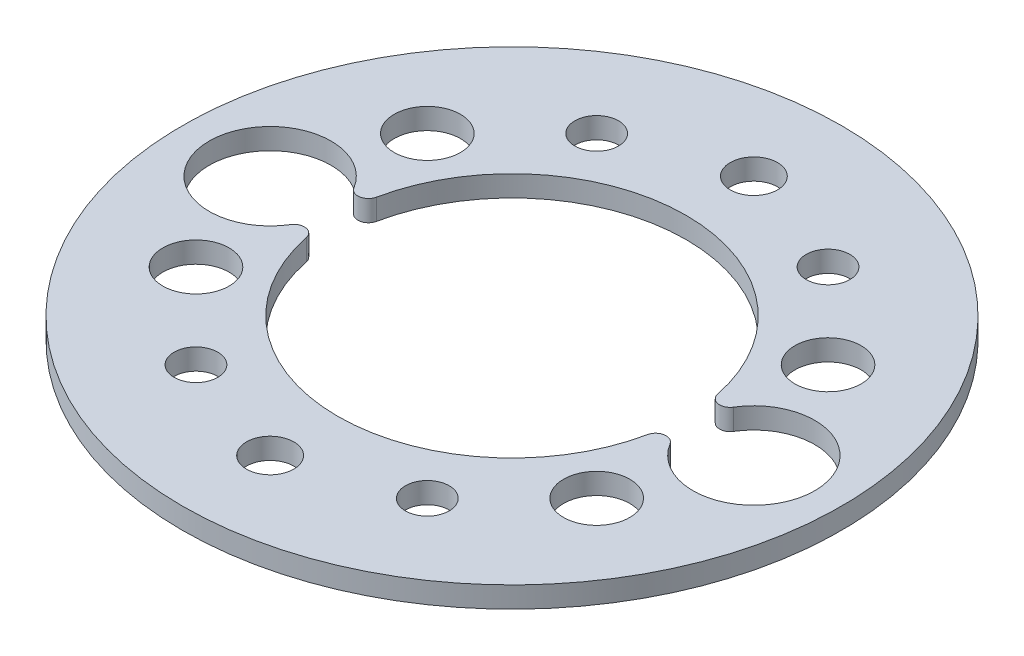
ISO-10303-21;
HEADER;
FILE_DESCRIPTION(('STEP AP214'),'2;1');
FILE_NAME('part.step','',(''),(''),'','','');
FILE_SCHEMA(('AUTOMOTIVE_DESIGN { 1 0 10303 214 1 1 1 1 }'));
ENDSEC;
DATA;
#1=APPLICATION_CONTEXT('core data for automotive mechanical design processes');
#2=APPLICATION_PROTOCOL_DEFINITION('international standard','automotive_design',2000,#1);
#3=PRODUCT_CONTEXT('',#1,'mechanical');
#4=PRODUCT('Part','Part','',(#3));
#5=PRODUCT_RELATED_PRODUCT_CATEGORY('part','',(#4));
#6=PRODUCT_DEFINITION_FORMATION('','',#4);
#7=PRODUCT_DEFINITION_CONTEXT('part definition',#1,'design');
#8=PRODUCT_DEFINITION('design','',#6,#7);
#9=PRODUCT_DEFINITION_SHAPE('','',#8);
#10=(LENGTH_UNIT() NAMED_UNIT(*) SI_UNIT(.MILLI.,.METRE.));
#11=(NAMED_UNIT(*) PLANE_ANGLE_UNIT() SI_UNIT($,.RADIAN.));
#12=(NAMED_UNIT(*) SI_UNIT($,.STERADIAN.) SOLID_ANGLE_UNIT());
#13=UNCERTAINTY_MEASURE_WITH_UNIT(LENGTH_MEASURE(1.E-05),#10,'distance_accuracy_value','');
#14=(GEOMETRIC_REPRESENTATION_CONTEXT(3) GLOBAL_UNCERTAINTY_ASSIGNED_CONTEXT((#13)) GLOBAL_UNIT_ASSIGNED_CONTEXT((#10,
#11,#12)) REPRESENTATION_CONTEXT('',''));
#15=CARTESIAN_POINT('',(0.,0.,0.));
#16=DIRECTION('',(0.,0.,1.));
#17=DIRECTION('',(1.,0.,0.));
#18=AXIS2_PLACEMENT_3D('',#15,#16,#17);
#19=CARTESIAN_POINT('',(0.,3.175,0.));
#20=DIRECTION('',(0.,1.,0.));
#21=DIRECTION('',(0.,0.,1.));
#22=AXIS2_PLACEMENT_3D('',#19,#20,#21);
#23=PLANE('',#22);
#24=CARTESIAN_POINT('',(0.,3.175,0.));
#25=DIRECTION('',(0.,1.,0.));
#26=DIRECTION('',(0.,0.,1.));
#27=AXIS2_PLACEMENT_3D('',#24,#25,#26);
#28=CIRCLE('',#27,26.289);
#29=CARTESIAN_POINT('',(25.7485611877278,3.175,-5.30312339681418));
#30=VERTEX_POINT('',#29);
#31=CARTESIAN_POINT('',(-25.7485611877278,3.175,-5.30312339681418));
#32=VERTEX_POINT('',#31);
#33=EDGE_CURVE('E112',#30,#32,#28,.T.);
#34=ORIENTED_EDGE('',*,*,#33,.F.);
#35=CARTESIAN_POINT('',(27.30342599375,3.175,-5.62336031691166));
#36=DIRECTION('',(0.,-1.,0.));
#37=DIRECTION('',(0.,0.,1.));
#38=AXIS2_PLACEMENT_3D('',#35,#36,#37);
#39=CIRCLE('',#38,1.5875);
#40=CARTESIAN_POINT('',(28.6582993211371,3.175,-4.79603056600513));
#41=VERTEX_POINT('',#40);
#42=EDGE_CURVE('E104',#41,#30,#39,.T.);
#43=ORIENTED_EDGE('',*,*,#42,.F.);
#44=CARTESIAN_POINT('',(36.5125,3.175,0.));
#45=DIRECTION('',(0.,1.,0.));
#46=DIRECTION('',(0.,0.,1.));
#47=AXIS2_PLACEMENT_3D('',#44,#45,#46);
#48=CIRCLE('',#47,9.2027375);
#49=CARTESIAN_POINT('',(28.6582993211371,3.175,4.79603056600514));
#50=VERTEX_POINT('',#49);
#51=EDGE_CURVE('E139',#50,#41,#48,.T.);
#52=ORIENTED_EDGE('',*,*,#51,.F.);
#53=CARTESIAN_POINT('',(27.30342599375,3.175,5.62336031691167));
#54=DIRECTION('',(0.,-1.,0.));
#55=DIRECTION('',(0.,0.,-1.));
#56=AXIS2_PLACEMENT_3D('',#53,#54,#55);
#57=CIRCLE('',#56,1.5875);
#58=CARTESIAN_POINT('',(25.7485611877278,3.175,5.3031233968142));
#59=VERTEX_POINT('',#58);
#60=EDGE_CURVE('E137',#59,#50,#57,.T.);
#61=ORIENTED_EDGE('',*,*,#60,.F.);
#62=CARTESIAN_POINT('',(0.,3.175,0.));
#63=DIRECTION('',(0.,1.,0.));
#64=DIRECTION('',(0.,0.,1.));
#65=AXIS2_PLACEMENT_3D('',#62,#63,#64);
#66=CIRCLE('',#65,26.289);
#67=CARTESIAN_POINT('',(-25.7485611877278,3.175,5.30312339681419));
#68=VERTEX_POINT('',#67);
#69=EDGE_CURVE('E135',#68,#59,#66,.T.);
#70=ORIENTED_EDGE('',*,*,#69,.F.);
#71=CARTESIAN_POINT('',(-27.30342599375,3.175,5.62336031691167));
#72=DIRECTION('',(0.,-1.,0.));
#73=DIRECTION('',(0.,0.,-1.));
#74=AXIS2_PLACEMENT_3D('',#71,#72,#73);
#75=CIRCLE('',#74,1.5875);
#76=CARTESIAN_POINT('',(-28.6582993211371,3.175,4.79603056600514));
#77=VERTEX_POINT('',#76);
#78=EDGE_CURVE('E133',#77,#68,#75,.T.);
#79=ORIENTED_EDGE('',*,*,#78,.F.);
#80=CARTESIAN_POINT('',(-36.5125,3.175,0.));
#81=DIRECTION('',(0.,1.,0.));
#82=DIRECTION('',(0.,0.,1.));
#83=AXIS2_PLACEMENT_3D('',#80,#81,#82);
#84=CIRCLE('',#83,9.2027375);
#85=CARTESIAN_POINT('',(-28.6582993211371,3.175,-4.79603056600513));
#86=VERTEX_POINT('',#85);
#87=EDGE_CURVE('E128',#86,#77,#84,.T.);
#88=ORIENTED_EDGE('',*,*,#87,.F.);
#89=CARTESIAN_POINT('',(-27.30342599375,3.175,-5.62336031691166));
#90=DIRECTION('',(0.,-1.,0.));
#91=DIRECTION('',(0.,0.,1.));
#92=AXIS2_PLACEMENT_3D('',#89,#90,#91);
#93=CIRCLE('',#92,1.5875);
#94=EDGE_CURVE('E126',#32,#86,#93,.T.);
#95=ORIENTED_EDGE('',*,*,#94,.F.);
#96=EDGE_LOOP('',(#34,#43,#52,#61,#70,#79,#88,#95));
#97=FACE_BOUND('',#96,.T.);
#98=CARTESIAN_POINT('',(-30.2459372271715,3.175,17.4625));
#99=DIRECTION('',(0.,1.,0.));
#100=DIRECTION('',(0.,0.,1.));
#101=AXIS2_PLACEMENT_3D('',#98,#99,#100);
#102=CIRCLE('',#101,5.);
#103=CARTESIAN_POINT('',(-30.2459372271715,3.175,22.4625));
#104=VERTEX_POINT('',#103);
#105=EDGE_CURVE('E172',#104,#104,#102,.T.);
#106=ORIENTED_EDGE('',*,*,#105,.F.);
#107=EDGE_LOOP('',(#106));
#108=FACE_BOUND('',#107,.T.);
#109=CARTESIAN_POINT('',(-17.4625,3.175,30.2459372271715));
#110=DIRECTION('',(0.,1.,0.));
#111=DIRECTION('',(0.,0.,1.));
#112=AXIS2_PLACEMENT_3D('',#109,#110,#111);
#113=CIRCLE('',#112,3.3);
#114=CARTESIAN_POINT('',(-17.4625,3.175,33.5459372271715));
#115=VERTEX_POINT('',#114);
#116=EDGE_CURVE('E184',#115,#115,#113,.T.);
#117=ORIENTED_EDGE('',*,*,#116,.F.);
#118=EDGE_LOOP('',(#117));
#119=FACE_BOUND('',#118,.T.);
#120=CARTESIAN_POINT('',(30.2459372271715,3.175,-17.4625));
#121=DIRECTION('',(0.,1.,0.));
#122=DIRECTION('',(0.,0.,1.));
#123=AXIS2_PLACEMENT_3D('',#120,#121,#122);
#124=CIRCLE('',#123,5.);
#125=CARTESIAN_POINT('',(30.2459372271715,3.175,-12.4625));
#126=VERTEX_POINT('',#125);
#127=EDGE_CURVE('E196',#126,#126,#124,.T.);
#128=ORIENTED_EDGE('',*,*,#127,.F.);
#129=EDGE_LOOP('',(#128));
#130=FACE_BOUND('',#129,.T.);
#131=CARTESIAN_POINT('',(17.4625,3.175,-30.2459372271715));
#132=DIRECTION('',(0.,1.,0.));
#133=DIRECTION('',(0.,0.,1.));
#134=AXIS2_PLACEMENT_3D('',#131,#132,#133);
#135=CIRCLE('',#134,3.3);
#136=CARTESIAN_POINT('',(17.4625,3.175,-26.9459372271715));
#137=VERTEX_POINT('',#136);
#138=EDGE_CURVE('E208',#137,#137,#135,.T.);
#139=ORIENTED_EDGE('',*,*,#138,.F.);
#140=EDGE_LOOP('',(#139));
#141=FACE_BOUND('',#140,.T.);
#142=CARTESIAN_POINT('',(0.,3.175,-36.5125));
#143=DIRECTION('',(0.,1.,0.));
#144=DIRECTION('',(0.,0.,1.));
#145=AXIS2_PLACEMENT_3D('',#142,#143,#144);
#146=CIRCLE('',#145,3.571875);
#147=CARTESIAN_POINT('',(0.,3.175,-32.940625));
#148=VERTEX_POINT('',#147);
#149=EDGE_CURVE('E220',#148,#148,#146,.T.);
#150=ORIENTED_EDGE('',*,*,#149,.F.);
#151=EDGE_LOOP('',(#150));
#152=FACE_BOUND('',#151,.T.);
#153=CARTESIAN_POINT('',(0.,3.175,0.));
#154=DIRECTION('',(0.,1.,0.));
#155=DIRECTION('',(0.,0.,1.));
#156=AXIS2_PLACEMENT_3D('',#153,#154,#155);
#157=CIRCLE('',#156,49.75);
#158=CARTESIAN_POINT('',(0.,3.175,49.75));
#159=VERTEX_POINT('',#158);
#160=EDGE_CURVE('E11',#159,#159,#157,.T.);
#161=ORIENTED_EDGE('',*,*,#160,.T.);
#162=EDGE_LOOP('',(#161));
#163=FACE_BOUND('',#162,.T.);
#164=CARTESIAN_POINT('',(0.,3.175,36.5125));
#165=DIRECTION('',(0.,1.,0.));
#166=DIRECTION('',(0.,0.,1.));
#167=AXIS2_PLACEMENT_3D('',#164,#165,#166);
#168=CIRCLE('',#167,3.571875);
#169=CARTESIAN_POINT('',(0.,3.175,40.084375));
#170=VERTEX_POINT('',#169);
#171=EDGE_CURVE('E214',#170,#170,#168,.T.);
#172=ORIENTED_EDGE('',*,*,#171,.F.);
#173=EDGE_LOOP('',(#172));
#174=FACE_BOUND('',#173,.T.);
#175=CARTESIAN_POINT('',(-30.2459372271715,3.175,-17.4625));
#176=DIRECTION('',(0.,1.,0.));
#177=DIRECTION('',(0.,0.,1.));
#178=AXIS2_PLACEMENT_3D('',#175,#176,#177);
#179=CIRCLE('',#178,5.);
#180=CARTESIAN_POINT('',(-30.2459372271715,3.175,-12.4625));
#181=VERTEX_POINT('',#180);
#182=EDGE_CURVE('E202',#181,#181,#179,.T.);
#183=ORIENTED_EDGE('',*,*,#182,.F.);
#184=EDGE_LOOP('',(#183));
#185=FACE_BOUND('',#184,.T.);
#186=CARTESIAN_POINT('',(-17.4624999999998,3.175,-30.2459372271716));
#187=DIRECTION('',(0.,1.,0.));
#188=DIRECTION('',(0.,0.,1.));
#189=AXIS2_PLACEMENT_3D('',#186,#187,#188);
#190=CIRCLE('',#189,3.3);
#191=CARTESIAN_POINT('',(-17.4624999999998,3.175,-26.9459372271716));
#192=VERTEX_POINT('',#191);
#193=EDGE_CURVE('E190',#192,#192,#190,.T.);
#194=ORIENTED_EDGE('',*,*,#193,.F.);
#195=EDGE_LOOP('',(#194));
#196=FACE_BOUND('',#195,.T.);
#197=CARTESIAN_POINT('',(17.4624999999998,3.175,30.2459372271716));
#198=DIRECTION('',(0.,1.,0.));
#199=DIRECTION('',(0.,0.,1.));
#200=AXIS2_PLACEMENT_3D('',#197,#198,#199);
#201=CIRCLE('',#200,3.3);
#202=CARTESIAN_POINT('',(17.4624999999998,3.175,33.5459372271716));
#203=VERTEX_POINT('',#202);
#204=EDGE_CURVE('E178',#203,#203,#201,.T.);
#205=ORIENTED_EDGE('',*,*,#204,.F.);
#206=EDGE_LOOP('',(#205));
#207=FACE_BOUND('',#206,.T.);
#208=CARTESIAN_POINT('',(30.2459372271715,3.175,17.4625));
#209=DIRECTION('',(0.,1.,0.));
#210=DIRECTION('',(0.,0.,1.));
#211=AXIS2_PLACEMENT_3D('',#208,#209,#210);
#212=CIRCLE('',#211,5.);
#213=CARTESIAN_POINT('',(30.2459372271715,3.175,22.4625));
#214=VERTEX_POINT('',#213);
#215=EDGE_CURVE('E142',#214,#214,#212,.T.);
#216=ORIENTED_EDGE('',*,*,#215,.F.);
#217=EDGE_LOOP('',(#216));
#218=FACE_BOUND('',#217,.T.);
#219=ADVANCED_FACE('F39',(#97,#108,#119,#130,#141,#152,#163,#174,#185,#196,#207,#218),#23,.T.);
#220=CARTESIAN_POINT('',(0.,0.,0.));
#221=DIRECTION('',(0.,1.,0.));
#222=DIRECTION('',(0.,0.,1.));
#223=AXIS2_PLACEMENT_3D('',#220,#221,#222);
#224=PLANE('',#223);
#225=CARTESIAN_POINT('',(-30.2459372271715,0.,17.4625));
#226=DIRECTION('',(0.,1.,0.));
#227=DIRECTION('',(0.,0.,1.));
#228=AXIS2_PLACEMENT_3D('',#225,#226,#227);
#229=CIRCLE('',#228,5.);
#230=CARTESIAN_POINT('',(-30.2459372271715,0.,22.4625));
#231=VERTEX_POINT('',#230);
#232=EDGE_CURVE('E120',#231,#231,#229,.T.);
#233=ORIENTED_EDGE('',*,*,#232,.T.);
#234=EDGE_LOOP('',(#233));
#235=FACE_BOUND('',#234,.T.);
#236=CARTESIAN_POINT('',(17.4624999999998,0.,30.2459372271716));
#237=DIRECTION('',(0.,1.,0.));
#238=DIRECTION('',(0.,0.,1.));
#239=AXIS2_PLACEMENT_3D('',#236,#237,#238);
#240=CIRCLE('',#239,3.3);
#241=CARTESIAN_POINT('',(17.4624999999998,0.,33.5459372271716));
#242=VERTEX_POINT('',#241);
#243=EDGE_CURVE('E175',#242,#242,#240,.T.);
#244=ORIENTED_EDGE('',*,*,#243,.T.);
#245=EDGE_LOOP('',(#244));
#246=FACE_BOUND('',#245,.T.);
#247=CARTESIAN_POINT('',(-17.4625,0.,30.2459372271715));
#248=DIRECTION('',(0.,1.,0.));
#249=DIRECTION('',(0.,0.,1.));
#250=AXIS2_PLACEMENT_3D('',#247,#248,#249);
#251=CIRCLE('',#250,3.3);
#252=CARTESIAN_POINT('',(-17.4625,0.,33.5459372271715));
#253=VERTEX_POINT('',#252);
#254=EDGE_CURVE('E181',#253,#253,#251,.T.);
#255=ORIENTED_EDGE('',*,*,#254,.T.);
#256=EDGE_LOOP('',(#255));
#257=FACE_BOUND('',#256,.T.);
#258=CARTESIAN_POINT('',(-17.4624999999998,0.,-30.2459372271716));
#259=DIRECTION('',(0.,1.,0.));
#260=DIRECTION('',(0.,0.,1.));
#261=AXIS2_PLACEMENT_3D('',#258,#259,#260);
#262=CIRCLE('',#261,3.3);
#263=CARTESIAN_POINT('',(-17.4624999999998,0.,-26.9459372271716));
#264=VERTEX_POINT('',#263);
#265=EDGE_CURVE('E187',#264,#264,#262,.T.);
#266=ORIENTED_EDGE('',*,*,#265,.T.);
#267=EDGE_LOOP('',(#266));
#268=FACE_BOUND('',#267,.T.);
#269=CARTESIAN_POINT('',(30.2459372271715,0.,-17.4625));
#270=DIRECTION('',(0.,1.,0.));
#271=DIRECTION('',(0.,0.,1.));
#272=AXIS2_PLACEMENT_3D('',#269,#270,#271);
#273=CIRCLE('',#272,5.);
#274=CARTESIAN_POINT('',(30.2459372271715,0.,-12.4625));
#275=VERTEX_POINT('',#274);
#276=EDGE_CURVE('E193',#275,#275,#273,.T.);
#277=ORIENTED_EDGE('',*,*,#276,.T.);
#278=EDGE_LOOP('',(#277));
#279=FACE_BOUND('',#278,.T.);
#280=CARTESIAN_POINT('',(-30.2459372271715,0.,-17.4625));
#281=DIRECTION('',(0.,1.,0.));
#282=DIRECTION('',(0.,0.,1.));
#283=AXIS2_PLACEMENT_3D('',#280,#281,#282);
#284=CIRCLE('',#283,5.);
#285=CARTESIAN_POINT('',(-30.2459372271715,0.,-12.4625));
#286=VERTEX_POINT('',#285);
#287=EDGE_CURVE('E199',#286,#286,#284,.T.);
#288=ORIENTED_EDGE('',*,*,#287,.T.);
#289=EDGE_LOOP('',(#288));
#290=FACE_BOUND('',#289,.T.);
#291=CARTESIAN_POINT('',(17.4625,0.,-30.2459372271715));
#292=DIRECTION('',(0.,1.,0.));
#293=DIRECTION('',(0.,0.,1.));
#294=AXIS2_PLACEMENT_3D('',#291,#292,#293);
#295=CIRCLE('',#294,3.3);
#296=CARTESIAN_POINT('',(17.4625,0.,-26.9459372271715));
#297=VERTEX_POINT('',#296);
#298=EDGE_CURVE('E205',#297,#297,#295,.T.);
#299=ORIENTED_EDGE('',*,*,#298,.T.);
#300=EDGE_LOOP('',(#299));
#301=FACE_BOUND('',#300,.T.);
#302=CARTESIAN_POINT('',(0.,0.,36.5125));
#303=DIRECTION('',(0.,1.,0.));
#304=DIRECTION('',(0.,0.,1.));
#305=AXIS2_PLACEMENT_3D('',#302,#303,#304);
#306=CIRCLE('',#305,3.571875);
#307=CARTESIAN_POINT('',(0.,0.,40.084375));
#308=VERTEX_POINT('',#307);
#309=EDGE_CURVE('E211',#308,#308,#306,.T.);
#310=ORIENTED_EDGE('',*,*,#309,.T.);
#311=EDGE_LOOP('',(#310));
#312=FACE_BOUND('',#311,.T.);
#313=CARTESIAN_POINT('',(0.,0.,-36.5125));
#314=DIRECTION('',(0.,1.,0.));
#315=DIRECTION('',(0.,0.,1.));
#316=AXIS2_PLACEMENT_3D('',#313,#314,#315);
#317=CIRCLE('',#316,3.571875);
#318=CARTESIAN_POINT('',(0.,0.,-32.940625));
#319=VERTEX_POINT('',#318);
#320=EDGE_CURVE('E217',#319,#319,#317,.T.);
#321=ORIENTED_EDGE('',*,*,#320,.T.);
#322=EDGE_LOOP('',(#321));
#323=FACE_BOUND('',#322,.T.);
#324=CARTESIAN_POINT('',(0.,0.,0.));
#325=DIRECTION('',(0.,1.,0.));
#326=DIRECTION('',(0.,0.,1.));
#327=AXIS2_PLACEMENT_3D('',#324,#325,#326);
#328=CIRCLE('',#327,49.75);
#329=CARTESIAN_POINT('',(0.,0.,49.75));
#330=VERTEX_POINT('',#329);
#331=EDGE_CURVE('E43',#330,#330,#328,.T.);
#332=ORIENTED_EDGE('',*,*,#331,.F.);
#333=EDGE_LOOP('',(#332));
#334=FACE_BOUND('',#333,.T.);
#335=CARTESIAN_POINT('',(27.30342599375,0.,-5.62336031691166));
#336=DIRECTION('',(0.,-1.,0.));
#337=DIRECTION('',(0.,0.,1.));
#338=AXIS2_PLACEMENT_3D('',#335,#336,#337);
#339=CIRCLE('',#338,1.5875);
#340=CARTESIAN_POINT('',(28.6582993211371,0.,-4.79603056600513));
#341=VERTEX_POINT('',#340);
#342=CARTESIAN_POINT('',(25.7485611877278,0.,-5.30312339681418));
#343=VERTEX_POINT('',#342);
#344=EDGE_CURVE('E62',#341,#343,#339,.T.);
#345=ORIENTED_EDGE('',*,*,#344,.T.);
#346=CARTESIAN_POINT('',(0.,0.,0.));
#347=DIRECTION('',(0.,1.,0.));
#348=DIRECTION('',(0.,0.,1.));
#349=AXIS2_PLACEMENT_3D('',#346,#347,#348);
#350=CIRCLE('',#349,26.289);
#351=CARTESIAN_POINT('',(-25.7485611877278,0.,-5.30312339681418));
#352=VERTEX_POINT('',#351);
#353=EDGE_CURVE('E119',#343,#352,#350,.T.);
#354=ORIENTED_EDGE('',*,*,#353,.T.);
#355=CARTESIAN_POINT('',(-27.30342599375,0.,-5.62336031691166));
#356=DIRECTION('',(0.,-1.,0.));
#357=DIRECTION('',(0.,0.,1.));
#358=AXIS2_PLACEMENT_3D('',#355,#356,#357);
#359=CIRCLE('',#358,1.5875);
#360=CARTESIAN_POINT('',(-28.6582993211371,0.,-4.79603056600513));
#361=VERTEX_POINT('',#360);
#362=EDGE_CURVE('E144',#352,#361,#359,.T.);
#363=ORIENTED_EDGE('',*,*,#362,.T.);
#364=CARTESIAN_POINT('',(-36.5125,0.,0.));
#365=DIRECTION('',(0.,1.,0.));
#366=DIRECTION('',(0.,0.,1.));
#367=AXIS2_PLACEMENT_3D('',#364,#365,#366);
#368=CIRCLE('',#367,9.2027375);
#369=CARTESIAN_POINT('',(-28.6582993211371,0.,4.79603056600514));
#370=VERTEX_POINT('',#369);
#371=EDGE_CURVE('E147',#361,#370,#368,.T.);
#372=ORIENTED_EDGE('',*,*,#371,.T.);
#373=CARTESIAN_POINT('',(-27.30342599375,0.,5.62336031691167));
#374=DIRECTION('',(0.,-1.,0.));
#375=DIRECTION('',(0.,0.,-1.));
#376=AXIS2_PLACEMENT_3D('',#373,#374,#375);
#377=CIRCLE('',#376,1.5875);
#378=CARTESIAN_POINT('',(-25.7485611877278,0.,5.30312339681419));
#379=VERTEX_POINT('',#378);
#380=EDGE_CURVE('E150',#370,#379,#377,.T.);
#381=ORIENTED_EDGE('',*,*,#380,.T.);
#382=CARTESIAN_POINT('',(0.,0.,0.));
#383=DIRECTION('',(0.,1.,0.));
#384=DIRECTION('',(0.,0.,1.));
#385=AXIS2_PLACEMENT_3D('',#382,#383,#384);
#386=CIRCLE('',#385,26.289);
#387=CARTESIAN_POINT('',(25.7485611877278,0.,5.3031233968142));
#388=VERTEX_POINT('',#387);
#389=EDGE_CURVE('E153',#379,#388,#386,.T.);
#390=ORIENTED_EDGE('',*,*,#389,.T.);
#391=CARTESIAN_POINT('',(27.30342599375,0.,5.62336031691167));
#392=DIRECTION('',(0.,-1.,0.));
#393=DIRECTION('',(0.,0.,-1.));
#394=AXIS2_PLACEMENT_3D('',#391,#392,#393);
#395=CIRCLE('',#394,1.5875);
#396=CARTESIAN_POINT('',(28.6582993211371,0.,4.79603056600514));
#397=VERTEX_POINT('',#396);
#398=EDGE_CURVE('E156',#388,#397,#395,.T.);
#399=ORIENTED_EDGE('',*,*,#398,.T.);
#400=CARTESIAN_POINT('',(36.5125,0.,0.));
#401=DIRECTION('',(0.,1.,0.));
#402=DIRECTION('',(0.,0.,1.));
#403=AXIS2_PLACEMENT_3D('',#400,#401,#402);
#404=CIRCLE('',#403,9.2027375);
#405=EDGE_CURVE('E113',#397,#341,#404,.T.);
#406=ORIENTED_EDGE('',*,*,#405,.T.);
#407=EDGE_LOOP('',(#345,#354,#363,#372,#381,#390,#399,#406));
#408=FACE_BOUND('',#407,.T.);
#409=CARTESIAN_POINT('',(30.2459372271715,0.,17.4625));
#410=DIRECTION('',(0.,1.,0.));
#411=DIRECTION('',(0.,0.,1.));
#412=AXIS2_PLACEMENT_3D('',#409,#410,#411);
#413=CIRCLE('',#412,5.);
#414=CARTESIAN_POINT('',(30.2459372271715,0.,22.4625));
#415=VERTEX_POINT('',#414);
#416=EDGE_CURVE('E334',#415,#415,#413,.T.);
#417=ORIENTED_EDGE('',*,*,#416,.T.);
#418=EDGE_LOOP('',(#417));
#419=FACE_BOUND('',#418,.T.);
#420=ADVANCED_FACE('F226',(#235,#246,#257,#268,#279,#290,#301,#312,#323,#334,#408,#419),#224,.F.);
#421=CARTESIAN_POINT('',(0.,3.175,0.));
#422=DIRECTION('',(0.,-1.,0.));
#423=DIRECTION('',(0.,0.,-1.));
#424=AXIS2_PLACEMENT_3D('',#421,#422,#423);
#425=CYLINDRICAL_SURFACE('',#424,49.75);
#426=ORIENTED_EDGE('',*,*,#160,.F.);
#427=EDGE_LOOP('',(#426));
#428=FACE_BOUND('',#427,.T.);
#429=ORIENTED_EDGE('',*,*,#331,.T.);
#430=EDGE_LOOP('',(#429));
#431=FACE_BOUND('',#430,.T.);
#432=ADVANCED_FACE('F41',(#428,#431),#425,.T.);
#433=CARTESIAN_POINT('',(0.,3.175,-36.5125));
#434=DIRECTION('',(0.,-1.,0.));
#435=DIRECTION('',(0.,0.,-1.));
#436=AXIS2_PLACEMENT_3D('',#433,#434,#435);
#437=CYLINDRICAL_SURFACE('',#436,3.571875);
#438=ORIENTED_EDGE('',*,*,#149,.T.);
#439=EDGE_LOOP('',(#438));
#440=FACE_BOUND('',#439,.T.);
#441=ORIENTED_EDGE('',*,*,#320,.F.);
#442=EDGE_LOOP('',(#441));
#443=FACE_BOUND('',#442,.T.);
#444=ADVANCED_FACE('F229',(#440,#443),#437,.F.);
#445=CARTESIAN_POINT('',(0.,3.175,36.5125));
#446=DIRECTION('',(0.,-1.,0.));
#447=DIRECTION('',(0.,0.,-1.));
#448=AXIS2_PLACEMENT_3D('',#445,#446,#447);
#449=CYLINDRICAL_SURFACE('',#448,3.571875);
#450=ORIENTED_EDGE('',*,*,#171,.T.);
#451=EDGE_LOOP('',(#450));
#452=FACE_BOUND('',#451,.T.);
#453=ORIENTED_EDGE('',*,*,#309,.F.);
#454=EDGE_LOOP('',(#453));
#455=FACE_BOUND('',#454,.T.);
#456=ADVANCED_FACE('F231',(#452,#455),#449,.F.);
#457=CARTESIAN_POINT('',(17.4625,3.175,-30.2459372271715));
#458=DIRECTION('',(0.,-1.,0.));
#459=DIRECTION('',(0.,0.,-1.));
#460=AXIS2_PLACEMENT_3D('',#457,#458,#459);
#461=CYLINDRICAL_SURFACE('',#460,3.3);
#462=ORIENTED_EDGE('',*,*,#138,.T.);
#463=EDGE_LOOP('',(#462));
#464=FACE_BOUND('',#463,.T.);
#465=ORIENTED_EDGE('',*,*,#298,.F.);
#466=EDGE_LOOP('',(#465));
#467=FACE_BOUND('',#466,.T.);
#468=ADVANCED_FACE('F238',(#464,#467),#461,.F.);
#469=CARTESIAN_POINT('',(-30.2459372271715,3.175,-17.4625));
#470=DIRECTION('',(0.,-1.,0.));
#471=DIRECTION('',(0.,0.,-1.));
#472=AXIS2_PLACEMENT_3D('',#469,#470,#471);
#473=CYLINDRICAL_SURFACE('',#472,5.);
#474=ORIENTED_EDGE('',*,*,#182,.T.);
#475=EDGE_LOOP('',(#474));
#476=FACE_BOUND('',#475,.T.);
#477=ORIENTED_EDGE('',*,*,#287,.F.);
#478=EDGE_LOOP('',(#477));
#479=FACE_BOUND('',#478,.T.);
#480=ADVANCED_FACE('F268',(#476,#479),#473,.F.);
#481=CARTESIAN_POINT('',(30.2459372271715,3.175,-17.4625));
#482=DIRECTION('',(0.,-1.,0.));
#483=DIRECTION('',(0.,0.,-1.));
#484=AXIS2_PLACEMENT_3D('',#481,#482,#483);
#485=CYLINDRICAL_SURFACE('',#484,5.);
#486=ORIENTED_EDGE('',*,*,#127,.T.);
#487=EDGE_LOOP('',(#486));
#488=FACE_BOUND('',#487,.T.);
#489=ORIENTED_EDGE('',*,*,#276,.F.);
#490=EDGE_LOOP('',(#489));
#491=FACE_BOUND('',#490,.T.);
#492=ADVANCED_FACE('F274',(#488,#491),#485,.F.);
#493=CARTESIAN_POINT('',(-17.4624999999998,3.175,-30.2459372271716));
#494=DIRECTION('',(0.,-1.,0.));
#495=DIRECTION('',(0.,0.,-1.));
#496=AXIS2_PLACEMENT_3D('',#493,#494,#495);
#497=CYLINDRICAL_SURFACE('',#496,3.3);
#498=ORIENTED_EDGE('',*,*,#193,.T.);
#499=EDGE_LOOP('',(#498));
#500=FACE_BOUND('',#499,.T.);
#501=ORIENTED_EDGE('',*,*,#265,.F.);
#502=EDGE_LOOP('',(#501));
#503=FACE_BOUND('',#502,.T.);
#504=ADVANCED_FACE('F280',(#500,#503),#497,.F.);
#505=CARTESIAN_POINT('',(-17.4625,3.175,30.2459372271715));
#506=DIRECTION('',(0.,-1.,0.));
#507=DIRECTION('',(0.,0.,-1.));
#508=AXIS2_PLACEMENT_3D('',#505,#506,#507);
#509=CYLINDRICAL_SURFACE('',#508,3.3);
#510=ORIENTED_EDGE('',*,*,#116,.T.);
#511=EDGE_LOOP('',(#510));
#512=FACE_BOUND('',#511,.T.);
#513=ORIENTED_EDGE('',*,*,#254,.F.);
#514=EDGE_LOOP('',(#513));
#515=FACE_BOUND('',#514,.T.);
#516=ADVANCED_FACE('F284',(#512,#515),#509,.F.);
#517=CARTESIAN_POINT('',(17.4624999999998,3.175,30.2459372271716));
#518=DIRECTION('',(0.,-1.,0.));
#519=DIRECTION('',(0.,0.,-1.));
#520=AXIS2_PLACEMENT_3D('',#517,#518,#519);
#521=CYLINDRICAL_SURFACE('',#520,3.3);
#522=ORIENTED_EDGE('',*,*,#204,.T.);
#523=EDGE_LOOP('',(#522));
#524=FACE_BOUND('',#523,.T.);
#525=ORIENTED_EDGE('',*,*,#243,.F.);
#526=EDGE_LOOP('',(#525));
#527=FACE_BOUND('',#526,.T.);
#528=ADVANCED_FACE('F288',(#524,#527),#521,.F.);
#529=CARTESIAN_POINT('',(-30.2459372271715,3.175,17.4625));
#530=DIRECTION('',(0.,-1.,0.));
#531=DIRECTION('',(0.,0.,-1.));
#532=AXIS2_PLACEMENT_3D('',#529,#530,#531);
#533=CYLINDRICAL_SURFACE('',#532,5.);
#534=ORIENTED_EDGE('',*,*,#105,.T.);
#535=EDGE_LOOP('',(#534));
#536=FACE_BOUND('',#535,.T.);
#537=ORIENTED_EDGE('',*,*,#232,.F.);
#538=EDGE_LOOP('',(#537));
#539=FACE_BOUND('',#538,.T.);
#540=ADVANCED_FACE('F292',(#536,#539),#533,.F.);
#541=CARTESIAN_POINT('',(27.30342599375,3.175,-5.62336031691166));
#542=DIRECTION('',(0.,-1.,0.));
#543=DIRECTION('',(0.,0.,-1.));
#544=AXIS2_PLACEMENT_3D('',#541,#542,#543);
#545=CYLINDRICAL_SURFACE('',#544,1.5875);
#546=ORIENTED_EDGE('',*,*,#344,.F.);
#547=DIRECTION('',(0.,-1.,0.));
#548=VECTOR('',#547,1.);
#549=CARTESIAN_POINT('',(28.6582993211371,3.175,-4.79603056600513));
#550=LINE('',#549,#548);
#551=EDGE_CURVE('E108',#41,#341,#550,.T.);
#552=ORIENTED_EDGE('',*,*,#551,.F.);
#553=ORIENTED_EDGE('',*,*,#42,.T.);
#554=DIRECTION('',(0.,-1.,0.));
#555=VECTOR('',#554,1.);
#556=CARTESIAN_POINT('',(25.7485611877278,3.175,-5.30312339681418));
#557=LINE('',#556,#555);
#558=EDGE_CURVE('E107',#30,#343,#557,.T.);
#559=ORIENTED_EDGE('',*,*,#558,.T.);
#560=EDGE_LOOP('',(#546,#552,#553,#559));
#561=FACE_BOUND('',#560,.T.);
#562=ADVANCED_FACE('F106',(#561),#545,.T.);
#563=CARTESIAN_POINT('',(0.,3.175,0.));
#564=DIRECTION('',(0.,-1.,0.));
#565=DIRECTION('',(0.,0.,-1.));
#566=AXIS2_PLACEMENT_3D('',#563,#564,#565);
#567=CYLINDRICAL_SURFACE('',#566,26.289);
#568=ORIENTED_EDGE('',*,*,#353,.F.);
#569=ORIENTED_EDGE('',*,*,#558,.F.);
#570=ORIENTED_EDGE('',*,*,#33,.T.);
#571=DIRECTION('',(0.,-1.,0.));
#572=VECTOR('',#571,1.);
#573=CARTESIAN_POINT('',(-25.7485611877278,3.175,-5.30312339681418));
#574=LINE('',#573,#572);
#575=EDGE_CURVE('E121',#32,#352,#574,.T.);
#576=ORIENTED_EDGE('',*,*,#575,.T.);
#577=EDGE_LOOP('',(#568,#569,#570,#576));
#578=FACE_BOUND('',#577,.T.);
#579=ADVANCED_FACE('F116',(#578),#567,.F.);
#580=CARTESIAN_POINT('',(-27.30342599375,3.175,-5.62336031691166));
#581=DIRECTION('',(0.,-1.,0.));
#582=DIRECTION('',(0.,0.,-1.));
#583=AXIS2_PLACEMENT_3D('',#580,#581,#582);
#584=CYLINDRICAL_SURFACE('',#583,1.5875);
#585=ORIENTED_EDGE('',*,*,#362,.F.);
#586=ORIENTED_EDGE('',*,*,#575,.F.);
#587=ORIENTED_EDGE('',*,*,#94,.T.);
#588=DIRECTION('',(0.,-1.,0.));
#589=VECTOR('',#588,1.);
#590=CARTESIAN_POINT('',(-28.6582993211371,3.175,-4.79603056600513));
#591=LINE('',#590,#589);
#592=EDGE_CURVE('E169',#86,#361,#591,.T.);
#593=ORIENTED_EDGE('',*,*,#592,.T.);
#594=EDGE_LOOP('',(#585,#586,#587,#593));
#595=FACE_BOUND('',#594,.T.);
#596=ADVANCED_FACE('F301',(#595),#584,.T.);
#597=CARTESIAN_POINT('',(-36.5125,3.175,0.));
#598=DIRECTION('',(0.,-1.,0.));
#599=DIRECTION('',(0.,0.,-1.));
#600=AXIS2_PLACEMENT_3D('',#597,#598,#599);
#601=CYLINDRICAL_SURFACE('',#600,9.2027375);
#602=ORIENTED_EDGE('',*,*,#371,.F.);
#603=ORIENTED_EDGE('',*,*,#592,.F.);
#604=ORIENTED_EDGE('',*,*,#87,.T.);
#605=DIRECTION('',(0.,-1.,0.));
#606=VECTOR('',#605,1.);
#607=CARTESIAN_POINT('',(-28.6582993211371,3.175,4.79603056600514));
#608=LINE('',#607,#606);
#609=EDGE_CURVE('E167',#77,#370,#608,.T.);
#610=ORIENTED_EDGE('',*,*,#609,.T.);
#611=EDGE_LOOP('',(#602,#603,#604,#610));
#612=FACE_BOUND('',#611,.T.);
#613=ADVANCED_FACE('F304',(#612),#601,.F.);
#614=CARTESIAN_POINT('',(-27.30342599375,3.175,5.62336031691167));
#615=DIRECTION('',(0.,-1.,0.));
#616=DIRECTION('',(0.,0.,-1.));
#617=AXIS2_PLACEMENT_3D('',#614,#615,#616);
#618=CYLINDRICAL_SURFACE('',#617,1.5875);
#619=ORIENTED_EDGE('',*,*,#380,.F.);
#620=ORIENTED_EDGE('',*,*,#609,.F.);
#621=ORIENTED_EDGE('',*,*,#78,.T.);
#622=DIRECTION('',(0.,-1.,0.));
#623=VECTOR('',#622,1.);
#624=CARTESIAN_POINT('',(-25.7485611877278,3.175,5.30312339681419));
#625=LINE('',#624,#623);
#626=EDGE_CURVE('E165',#68,#379,#625,.T.);
#627=ORIENTED_EDGE('',*,*,#626,.T.);
#628=EDGE_LOOP('',(#619,#620,#621,#627));
#629=FACE_BOUND('',#628,.T.);
#630=ADVANCED_FACE('F308',(#629),#618,.T.);
#631=CARTESIAN_POINT('',(0.,3.175,0.));
#632=DIRECTION('',(0.,-1.,0.));
#633=DIRECTION('',(0.,0.,-1.));
#634=AXIS2_PLACEMENT_3D('',#631,#632,#633);
#635=CYLINDRICAL_SURFACE('',#634,26.289);
#636=ORIENTED_EDGE('',*,*,#389,.F.);
#637=ORIENTED_EDGE('',*,*,#626,.F.);
#638=ORIENTED_EDGE('',*,*,#69,.T.);
#639=DIRECTION('',(0.,-1.,0.));
#640=VECTOR('',#639,1.);
#641=CARTESIAN_POINT('',(25.7485611877278,3.175,5.3031233968142));
#642=LINE('',#641,#640);
#643=EDGE_CURVE('E163',#59,#388,#642,.T.);
#644=ORIENTED_EDGE('',*,*,#643,.T.);
#645=EDGE_LOOP('',(#636,#637,#638,#644));
#646=FACE_BOUND('',#645,.T.);
#647=ADVANCED_FACE('F312',(#646),#635,.F.);
#648=CARTESIAN_POINT('',(27.30342599375,3.175,5.62336031691167));
#649=DIRECTION('',(0.,-1.,0.));
#650=DIRECTION('',(0.,0.,-1.));
#651=AXIS2_PLACEMENT_3D('',#648,#649,#650);
#652=CYLINDRICAL_SURFACE('',#651,1.5875);
#653=ORIENTED_EDGE('',*,*,#398,.F.);
#654=ORIENTED_EDGE('',*,*,#643,.F.);
#655=ORIENTED_EDGE('',*,*,#60,.T.);
#656=DIRECTION('',(0.,-1.,0.));
#657=VECTOR('',#656,1.);
#658=CARTESIAN_POINT('',(28.6582993211371,3.175,4.79603056600514));
#659=LINE('',#658,#657);
#660=EDGE_CURVE('E54',#50,#397,#659,.T.);
#661=ORIENTED_EDGE('',*,*,#660,.T.);
#662=EDGE_LOOP('',(#653,#654,#655,#661));
#663=FACE_BOUND('',#662,.T.);
#664=ADVANCED_FACE('F316',(#663),#652,.T.);
#665=CARTESIAN_POINT('',(36.5125,3.175,0.));
#666=DIRECTION('',(0.,-1.,0.));
#667=DIRECTION('',(0.,0.,-1.));
#668=AXIS2_PLACEMENT_3D('',#665,#666,#667);
#669=CYLINDRICAL_SURFACE('',#668,9.2027375);
#670=ORIENTED_EDGE('',*,*,#405,.F.);
#671=ORIENTED_EDGE('',*,*,#660,.F.);
#672=ORIENTED_EDGE('',*,*,#51,.T.);
#673=ORIENTED_EDGE('',*,*,#551,.T.);
#674=EDGE_LOOP('',(#670,#671,#672,#673));
#675=FACE_BOUND('',#674,.T.);
#676=ADVANCED_FACE('F320',(#675),#669,.F.);
#677=CARTESIAN_POINT('',(30.2459372271715,3.175,17.4625));
#678=DIRECTION('',(0.,-1.,0.));
#679=DIRECTION('',(0.,0.,-1.));
#680=AXIS2_PLACEMENT_3D('',#677,#678,#679);
#681=CYLINDRICAL_SURFACE('',#680,5.);
#682=ORIENTED_EDGE('',*,*,#215,.T.);
#683=EDGE_LOOP('',(#682));
#684=FACE_BOUND('',#683,.T.);
#685=ORIENTED_EDGE('',*,*,#416,.F.);
#686=EDGE_LOOP('',(#685));
#687=FACE_BOUND('',#686,.T.);
#688=ADVANCED_FACE('F324',(#684,#687),#681,.F.);
#689=CLOSED_SHELL('',(#219,#420,#432,#444,#456,#468,#480,#492,#504,#516,#528,#540,#562,#579,
#596,#613,#630,#647,#664,#676,#688));
#690=MANIFOLD_SOLID_BREP('B2',#689);
#691=ADVANCED_BREP_SHAPE_REPRESENTATION('',(#18,#690),#14);
#692=SHAPE_DEFINITION_REPRESENTATION(#9,#691);
ENDSEC;
END-ISO-10303-21;
